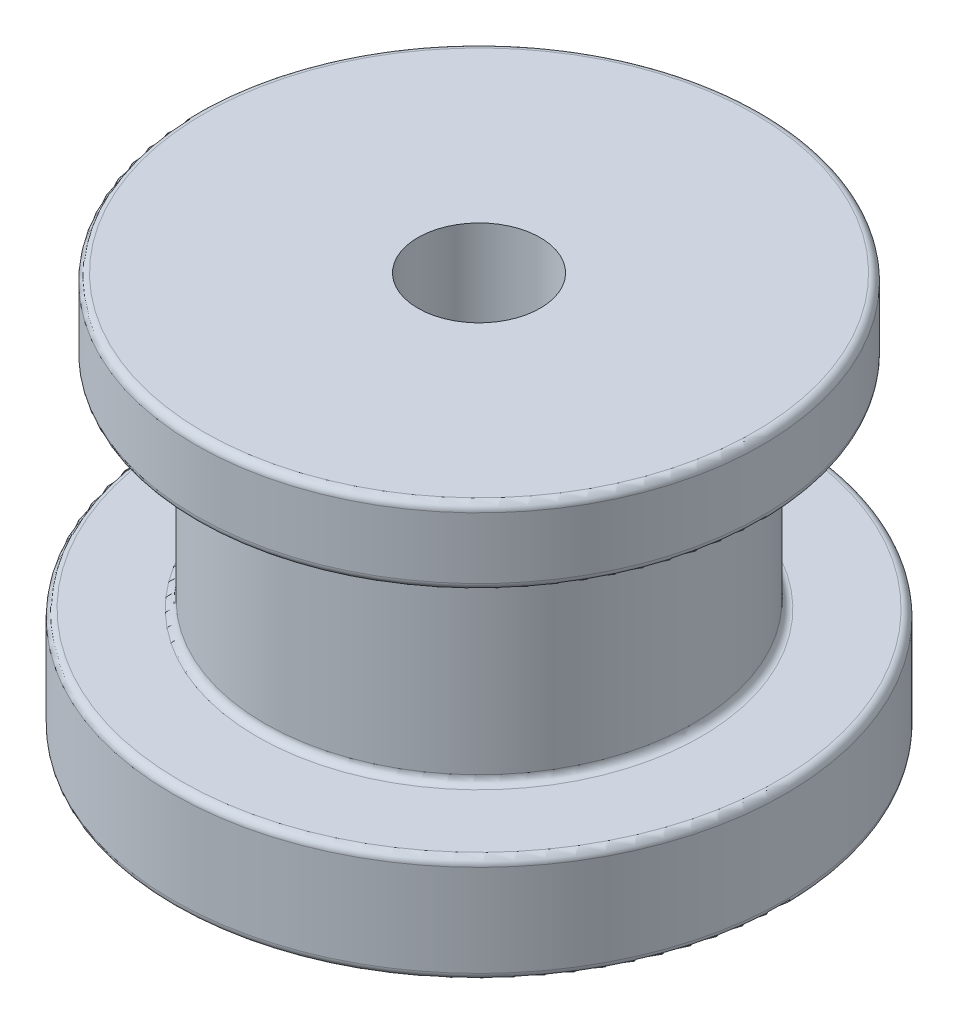
ISO-10303-21;
HEADER;
FILE_DESCRIPTION(('STEP AP214'),'2;1');
FILE_NAME('part.step','',(''),(''),'','','');
FILE_SCHEMA(('AUTOMOTIVE_DESIGN { 1 0 10303 214 1 1 1 1 }'));
ENDSEC;
DATA;
#1=APPLICATION_CONTEXT('core data for automotive mechanical design processes');
#2=APPLICATION_PROTOCOL_DEFINITION('international standard','automotive_design',2000,#1);
#3=PRODUCT_CONTEXT('',#1,'mechanical');
#4=PRODUCT('Part','Part','',(#3));
#5=PRODUCT_RELATED_PRODUCT_CATEGORY('part','',(#4));
#6=PRODUCT_DEFINITION_FORMATION('','',#4);
#7=PRODUCT_DEFINITION_CONTEXT('part definition',#1,'design');
#8=PRODUCT_DEFINITION('design','',#6,#7);
#9=PRODUCT_DEFINITION_SHAPE('','',#8);
#10=(LENGTH_UNIT() NAMED_UNIT(*) SI_UNIT(.MILLI.,.METRE.));
#11=(NAMED_UNIT(*) PLANE_ANGLE_UNIT() SI_UNIT($,.RADIAN.));
#12=(NAMED_UNIT(*) SI_UNIT($,.STERADIAN.) SOLID_ANGLE_UNIT());
#13=UNCERTAINTY_MEASURE_WITH_UNIT(LENGTH_MEASURE(1.E-05),#10,'distance_accuracy_value','');
#14=(GEOMETRIC_REPRESENTATION_CONTEXT(3) GLOBAL_UNCERTAINTY_ASSIGNED_CONTEXT((#13)) GLOBAL_UNIT_ASSIGNED_CONTEXT((#10,
#11,#12)) REPRESENTATION_CONTEXT('',''));
#15=CARTESIAN_POINT('',(0.,0.,0.));
#16=DIRECTION('',(0.,0.,1.));
#17=DIRECTION('',(1.,0.,0.));
#18=AXIS2_PLACEMENT_3D('',#15,#16,#17);
#19=CARTESIAN_POINT('',(0.,13.,0.));
#20=DIRECTION('',(0.,1.,0.));
#21=DIRECTION('',(0.,0.,1.));
#22=AXIS2_PLACEMENT_3D('',#19,#20,#21);
#23=CYLINDRICAL_SURFACE('',#22,4.);
#24=CARTESIAN_POINT('',(0.,-13.,0.));
#25=DIRECTION('',(0.,1.,0.));
#26=DIRECTION('',(0.,0.,1.));
#27=AXIS2_PLACEMENT_3D('',#24,#25,#26);
#28=CIRCLE('',#27,4.);
#29=CARTESIAN_POINT('',(0.,-13.,4.));
#30=VERTEX_POINT('',#29);
#31=EDGE_CURVE('E10',#30,#30,#28,.T.);
#32=ORIENTED_EDGE('',*,*,#31,.F.);
#33=EDGE_LOOP('',(#32));
#34=FACE_BOUND('',#33,.T.);
#35=CARTESIAN_POINT('',(0.,13.,0.));
#36=DIRECTION('',(0.,1.,0.));
#37=DIRECTION('',(0.,0.,1.));
#38=AXIS2_PLACEMENT_3D('',#35,#36,#37);
#39=CIRCLE('',#38,4.);
#40=CARTESIAN_POINT('',(0.,13.,4.));
#41=VERTEX_POINT('',#40);
#42=EDGE_CURVE('E96',#41,#41,#39,.T.);
#43=ORIENTED_EDGE('',*,*,#42,.T.);
#44=EDGE_LOOP('',(#43));
#45=FACE_BOUND('',#44,.T.);
#46=ADVANCED_FACE('F37',(#34,#45),#23,.F.);
#47=CARTESIAN_POINT('',(0.,-13.,-4.));
#48=DIRECTION('',(0.,1.,0.));
#49=DIRECTION('',(0.,0.,1.));
#50=AXIS2_PLACEMENT_3D('',#47,#48,#49);
#51=PLANE('',#50);
#52=CARTESIAN_POINT('',(0.,-13.,0.));
#53=DIRECTION('',(0.,1.,0.));
#54=DIRECTION('',(0.,0.,1.));
#55=AXIS2_PLACEMENT_3D('',#52,#53,#54);
#56=CIRCLE('',#55,19.5);
#57=CARTESIAN_POINT('',(0.,-13.,19.5));
#58=VERTEX_POINT('',#57);
#59=EDGE_CURVE('E44',#58,#58,#56,.T.);
#60=ORIENTED_EDGE('',*,*,#59,.F.);
#61=EDGE_LOOP('',(#60));
#62=FACE_BOUND('',#61,.T.);
#63=ORIENTED_EDGE('',*,*,#31,.T.);
#64=EDGE_LOOP('',(#63));
#65=FACE_BOUND('',#64,.T.);
#66=ADVANCED_FACE('F170',(#62,#65),#51,.F.);
#67=CARTESIAN_POINT('',(0.,-12.5,0.));
#68=DIRECTION('',(0.,1.,0.));
#69=DIRECTION('',(0.,0.,1.));
#70=AXIS2_PLACEMENT_3D('',#67,#68,#69);
#71=TOROIDAL_SURFACE('',#70,19.5,0.5);
#72=CARTESIAN_POINT('',(0.,-12.5,0.));
#73=DIRECTION('',(0.,1.,0.));
#74=DIRECTION('',(0.,0.,1.));
#75=AXIS2_PLACEMENT_3D('',#72,#73,#74);
#76=CIRCLE('',#75,20.);
#77=CARTESIAN_POINT('',(0.,-12.5,20.));
#78=VERTEX_POINT('',#77);
#79=EDGE_CURVE('E49',#78,#78,#76,.T.);
#80=ORIENTED_EDGE('',*,*,#79,.F.);
#81=EDGE_LOOP('',(#80));
#82=FACE_BOUND('',#81,.T.);
#83=ORIENTED_EDGE('',*,*,#59,.T.);
#84=EDGE_LOOP('',(#83));
#85=FACE_BOUND('',#84,.T.);
#86=ADVANCED_FACE('F165',(#82,#85),#71,.T.);
#87=CARTESIAN_POINT('',(0.,13.,0.));
#88=DIRECTION('',(0.,1.,0.));
#89=DIRECTION('',(0.,0.,1.));
#90=AXIS2_PLACEMENT_3D('',#87,#88,#89);
#91=CYLINDRICAL_SURFACE('',#90,20.);
#92=CARTESIAN_POINT('',(0.,-6.5,0.));
#93=DIRECTION('',(0.,1.,0.));
#94=DIRECTION('',(0.,0.,1.));
#95=AXIS2_PLACEMENT_3D('',#92,#93,#94);
#96=CIRCLE('',#95,20.);
#97=CARTESIAN_POINT('',(0.,-6.50000000000001,20.));
#98=VERTEX_POINT('',#97);
#99=EDGE_CURVE('E54',#98,#98,#96,.T.);
#100=ORIENTED_EDGE('',*,*,#99,.F.);
#101=EDGE_LOOP('',(#100));
#102=FACE_BOUND('',#101,.T.);
#103=ORIENTED_EDGE('',*,*,#79,.T.);
#104=EDGE_LOOP('',(#103));
#105=FACE_BOUND('',#104,.T.);
#106=ADVANCED_FACE('F159',(#102,#105),#91,.T.);
#107=CARTESIAN_POINT('',(0.,-6.50000000000001,0.));
#108=DIRECTION('',(0.,1.,0.));
#109=DIRECTION('',(0.,0.,1.));
#110=AXIS2_PLACEMENT_3D('',#107,#108,#109);
#111=TOROIDAL_SURFACE('',#110,19.5,0.5);
#112=CARTESIAN_POINT('',(0.,-6.,0.));
#113=DIRECTION('',(0.,1.,0.));
#114=DIRECTION('',(0.,0.,1.));
#115=AXIS2_PLACEMENT_3D('',#112,#113,#114);
#116=CIRCLE('',#115,19.5);
#117=CARTESIAN_POINT('',(0.,-6.00000000000001,19.5));
#118=VERTEX_POINT('',#117);
#119=EDGE_CURVE('E60',#118,#118,#116,.T.);
#120=ORIENTED_EDGE('',*,*,#119,.F.);
#121=EDGE_LOOP('',(#120));
#122=FACE_BOUND('',#121,.T.);
#123=ORIENTED_EDGE('',*,*,#99,.T.);
#124=EDGE_LOOP('',(#123));
#125=FACE_BOUND('',#124,.T.);
#126=ADVANCED_FACE('F153',(#122,#125),#111,.T.);
#127=CARTESIAN_POINT('',(0.,-6.,-19.5));
#128=DIRECTION('',(0.,-1.,0.));
#129=DIRECTION('',(0.,0.,-1.));
#130=AXIS2_PLACEMENT_3D('',#127,#128,#129);
#131=PLANE('',#130);
#132=CARTESIAN_POINT('',(0.,-6.,0.));
#133=DIRECTION('',(0.,1.,0.));
#134=DIRECTION('',(0.,0.,1.));
#135=AXIS2_PLACEMENT_3D('',#132,#133,#134);
#136=CIRCLE('',#135,14.5);
#137=CARTESIAN_POINT('',(0.,-6.00000000000001,14.5));
#138=VERTEX_POINT('',#137);
#139=EDGE_CURVE('E64',#138,#138,#136,.T.);
#140=ORIENTED_EDGE('',*,*,#139,.F.);
#141=EDGE_LOOP('',(#140));
#142=FACE_BOUND('',#141,.T.);
#143=ORIENTED_EDGE('',*,*,#119,.T.);
#144=EDGE_LOOP('',(#143));
#145=FACE_BOUND('',#144,.T.);
#146=ADVANCED_FACE('F147',(#142,#145),#131,.F.);
#147=CARTESIAN_POINT('',(0.,-5.5,0.));
#148=DIRECTION('',(0.,1.,0.));
#149=DIRECTION('',(0.,0.,1.));
#150=AXIS2_PLACEMENT_3D('',#147,#148,#149);
#151=TOROIDAL_SURFACE('',#150,14.5,0.5);
#152=CARTESIAN_POINT('',(0.,-5.5,0.));
#153=DIRECTION('',(0.,1.,0.));
#154=DIRECTION('',(0.,0.,1.));
#155=AXIS2_PLACEMENT_3D('',#152,#153,#154);
#156=CIRCLE('',#155,14.);
#157=CARTESIAN_POINT('',(0.,-5.50000000000001,14.));
#158=VERTEX_POINT('',#157);
#159=EDGE_CURVE('E68',#158,#158,#156,.T.);
#160=ORIENTED_EDGE('',*,*,#159,.F.);
#161=EDGE_LOOP('',(#160));
#162=FACE_BOUND('',#161,.T.);
#163=ORIENTED_EDGE('',*,*,#139,.T.);
#164=EDGE_LOOP('',(#163));
#165=FACE_BOUND('',#164,.T.);
#166=ADVANCED_FACE('F141',(#162,#165),#151,.F.);
#167=CARTESIAN_POINT('',(0.,13.,0.));
#168=DIRECTION('',(0.,1.,0.));
#169=DIRECTION('',(0.,0.,1.));
#170=AXIS2_PLACEMENT_3D('',#167,#168,#169);
#171=CYLINDRICAL_SURFACE('',#170,14.);
#172=CARTESIAN_POINT('',(0.,7.5,0.));
#173=DIRECTION('',(0.,1.,0.));
#174=DIRECTION('',(0.,0.,1.));
#175=AXIS2_PLACEMENT_3D('',#172,#173,#174);
#176=CIRCLE('',#175,14.);
#177=CARTESIAN_POINT('',(0.,7.5,14.));
#178=VERTEX_POINT('',#177);
#179=EDGE_CURVE('E72',#178,#178,#176,.T.);
#180=ORIENTED_EDGE('',*,*,#179,.F.);
#181=EDGE_LOOP('',(#180));
#182=FACE_BOUND('',#181,.T.);
#183=ORIENTED_EDGE('',*,*,#159,.T.);
#184=EDGE_LOOP('',(#183));
#185=FACE_BOUND('',#184,.T.);
#186=ADVANCED_FACE('F135',(#182,#185),#171,.T.);
#187=CARTESIAN_POINT('',(0.,7.5,0.));
#188=DIRECTION('',(0.,1.,0.));
#189=DIRECTION('',(0.,0.,1.));
#190=AXIS2_PLACEMENT_3D('',#187,#188,#189);
#191=TOROIDAL_SURFACE('',#190,14.5,0.5);
#192=CARTESIAN_POINT('',(0.,8.,0.));
#193=DIRECTION('',(0.,1.,0.));
#194=DIRECTION('',(0.,0.,1.));
#195=AXIS2_PLACEMENT_3D('',#192,#193,#194);
#196=CIRCLE('',#195,14.5);
#197=CARTESIAN_POINT('',(0.,8.,14.5));
#198=VERTEX_POINT('',#197);
#199=EDGE_CURVE('E76',#198,#198,#196,.T.);
#200=ORIENTED_EDGE('',*,*,#199,.F.);
#201=EDGE_LOOP('',(#200));
#202=FACE_BOUND('',#201,.T.);
#203=ORIENTED_EDGE('',*,*,#179,.T.);
#204=EDGE_LOOP('',(#203));
#205=FACE_BOUND('',#204,.T.);
#206=ADVANCED_FACE('F129',(#202,#205),#191,.F.);
#207=CARTESIAN_POINT('',(0.,8.00000000000001,-14.5));
#208=DIRECTION('',(0.,1.,0.));
#209=DIRECTION('',(0.,0.,1.));
#210=AXIS2_PLACEMENT_3D('',#207,#208,#209);
#211=PLANE('',#210);
#212=CARTESIAN_POINT('',(0.,8.,0.));
#213=DIRECTION('',(0.,1.,0.));
#214=DIRECTION('',(0.,0.,1.));
#215=AXIS2_PLACEMENT_3D('',#212,#213,#214);
#216=CIRCLE('',#215,18.);
#217=CARTESIAN_POINT('',(0.,8.,18.));
#218=VERTEX_POINT('',#217);
#219=EDGE_CURVE('E80',#218,#218,#216,.T.);
#220=ORIENTED_EDGE('',*,*,#219,.F.);
#221=EDGE_LOOP('',(#220));
#222=FACE_BOUND('',#221,.T.);
#223=ORIENTED_EDGE('',*,*,#199,.T.);
#224=EDGE_LOOP('',(#223));
#225=FACE_BOUND('',#224,.T.);
#226=ADVANCED_FACE('F123',(#222,#225),#211,.F.);
#227=CARTESIAN_POINT('',(0.,8.5,0.));
#228=DIRECTION('',(0.,1.,0.));
#229=DIRECTION('',(0.,0.,1.));
#230=AXIS2_PLACEMENT_3D('',#227,#228,#229);
#231=TOROIDAL_SURFACE('',#230,18.,0.5);
#232=CARTESIAN_POINT('',(0.,8.5,0.));
#233=DIRECTION('',(0.,1.,0.));
#234=DIRECTION('',(0.,0.,1.));
#235=AXIS2_PLACEMENT_3D('',#232,#233,#234);
#236=CIRCLE('',#235,18.5);
#237=CARTESIAN_POINT('',(0.,8.49999999999999,18.5));
#238=VERTEX_POINT('',#237);
#239=EDGE_CURVE('E84',#238,#238,#236,.T.);
#240=ORIENTED_EDGE('',*,*,#239,.F.);
#241=EDGE_LOOP('',(#240));
#242=FACE_BOUND('',#241,.T.);
#243=ORIENTED_EDGE('',*,*,#219,.T.);
#244=EDGE_LOOP('',(#243));
#245=FACE_BOUND('',#244,.T.);
#246=ADVANCED_FACE('F117',(#242,#245),#231,.T.);
#247=CARTESIAN_POINT('',(0.,13.,0.));
#248=DIRECTION('',(0.,1.,0.));
#249=DIRECTION('',(0.,0.,1.));
#250=AXIS2_PLACEMENT_3D('',#247,#248,#249);
#251=CYLINDRICAL_SURFACE('',#250,18.5);
#252=CARTESIAN_POINT('',(0.,12.5,0.));
#253=DIRECTION('',(0.,1.,0.));
#254=DIRECTION('',(0.,0.,1.));
#255=AXIS2_PLACEMENT_3D('',#252,#253,#254);
#256=CIRCLE('',#255,18.5);
#257=CARTESIAN_POINT('',(0.,12.5,18.5));
#258=VERTEX_POINT('',#257);
#259=EDGE_CURVE('E88',#258,#258,#256,.T.);
#260=ORIENTED_EDGE('',*,*,#259,.F.);
#261=EDGE_LOOP('',(#260));
#262=FACE_BOUND('',#261,.T.);
#263=ORIENTED_EDGE('',*,*,#239,.T.);
#264=EDGE_LOOP('',(#263));
#265=FACE_BOUND('',#264,.T.);
#266=ADVANCED_FACE('F111',(#262,#265),#251,.T.);
#267=CARTESIAN_POINT('',(0.,12.5,0.));
#268=DIRECTION('',(0.,1.,0.));
#269=DIRECTION('',(0.,0.,1.));
#270=AXIS2_PLACEMENT_3D('',#267,#268,#269);
#271=TOROIDAL_SURFACE('',#270,18.,0.499999999999999);
#272=CARTESIAN_POINT('',(0.,13.,0.));
#273=DIRECTION('',(0.,1.,0.));
#274=DIRECTION('',(0.,0.,1.));
#275=AXIS2_PLACEMENT_3D('',#272,#273,#274);
#276=CIRCLE('',#275,18.);
#277=CARTESIAN_POINT('',(0.,13.,18.));
#278=VERTEX_POINT('',#277);
#279=EDGE_CURVE('E92',#278,#278,#276,.T.);
#280=ORIENTED_EDGE('',*,*,#279,.F.);
#281=EDGE_LOOP('',(#280));
#282=FACE_BOUND('',#281,.T.);
#283=ORIENTED_EDGE('',*,*,#259,.T.);
#284=EDGE_LOOP('',(#283));
#285=FACE_BOUND('',#284,.T.);
#286=ADVANCED_FACE('F105',(#282,#285),#271,.T.);
#287=CARTESIAN_POINT('',(0.,13.,-18.));
#288=DIRECTION('',(0.,-1.,0.));
#289=DIRECTION('',(0.,0.,-1.));
#290=AXIS2_PLACEMENT_3D('',#287,#288,#289);
#291=PLANE('',#290);
#292=ORIENTED_EDGE('',*,*,#42,.F.);
#293=EDGE_LOOP('',(#292));
#294=FACE_BOUND('',#293,.T.);
#295=ORIENTED_EDGE('',*,*,#279,.T.);
#296=EDGE_LOOP('',(#295));
#297=FACE_BOUND('',#296,.T.);
#298=ADVANCED_FACE('F102',(#294,#297),#291,.F.);
#299=CLOSED_SHELL('',(#46,#66,#86,#106,#126,#146,#166,#186,#206,#226,#246,#266,#286,#298));
#300=MANIFOLD_SOLID_BREP('B2',#299);
#301=ADVANCED_BREP_SHAPE_REPRESENTATION('',(#18,#300),#14);
#302=SHAPE_DEFINITION_REPRESENTATION(#9,#301);
ENDSEC;
END-ISO-10303-21;
